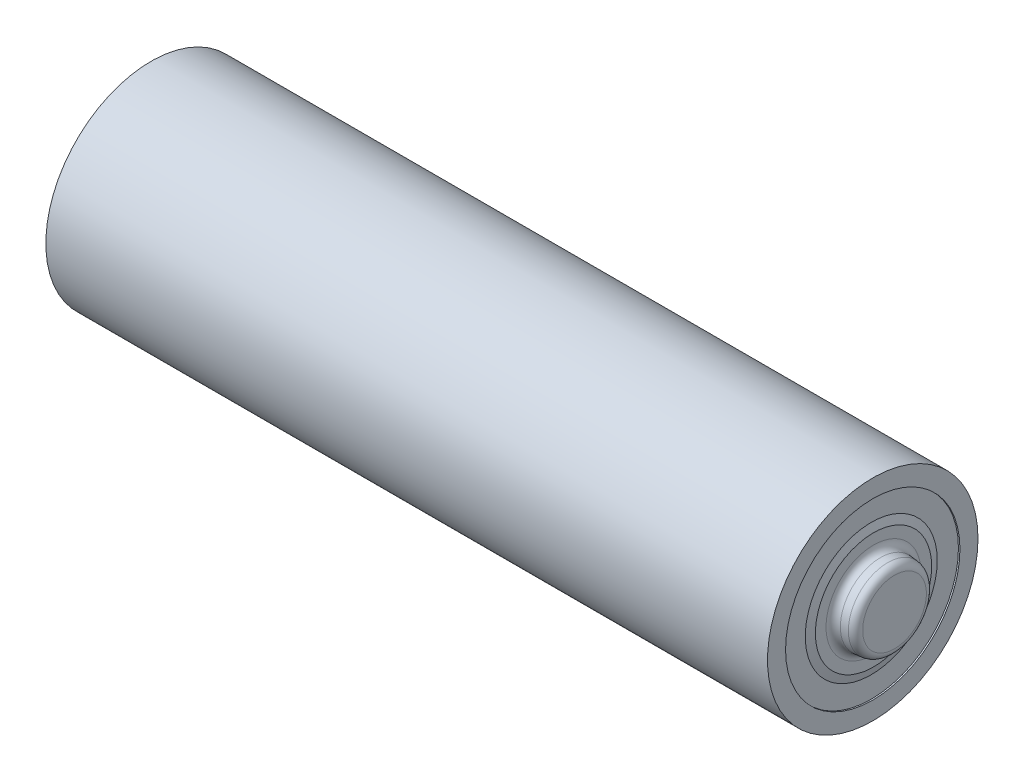
ISO-10303-21;
HEADER;
FILE_DESCRIPTION(('STEP AP214'),'2;1');
FILE_NAME('part.step','',(''),(''),'','','');
FILE_SCHEMA(('AUTOMOTIVE_DESIGN { 1 0 10303 214 1 1 1 1 }'));
ENDSEC;
DATA;
#1=APPLICATION_CONTEXT('core data for automotive mechanical design processes');
#2=APPLICATION_PROTOCOL_DEFINITION('international standard','automotive_design',2000,#1);
#3=PRODUCT_CONTEXT('',#1,'mechanical');
#4=PRODUCT('Part','Part','',(#3));
#5=PRODUCT_RELATED_PRODUCT_CATEGORY('part','',(#4));
#6=PRODUCT_DEFINITION_FORMATION('','',#4);
#7=PRODUCT_DEFINITION_CONTEXT('part definition',#1,'design');
#8=PRODUCT_DEFINITION('design','',#6,#7);
#9=PRODUCT_DEFINITION_SHAPE('','',#8);
#10=(LENGTH_UNIT() NAMED_UNIT(*) SI_UNIT(.MILLI.,.METRE.));
#11=(NAMED_UNIT(*) PLANE_ANGLE_UNIT() SI_UNIT($,.RADIAN.));
#12=(NAMED_UNIT(*) SI_UNIT($,.STERADIAN.) SOLID_ANGLE_UNIT());
#13=UNCERTAINTY_MEASURE_WITH_UNIT(LENGTH_MEASURE(1.E-05),#10,'distance_accuracy_value','');
#14=(GEOMETRIC_REPRESENTATION_CONTEXT(3) GLOBAL_UNCERTAINTY_ASSIGNED_CONTEXT((#13)) GLOBAL_UNIT_ASSIGNED_CONTEXT((#10,
#11,#12)) REPRESENTATION_CONTEXT('',''));
#15=CARTESIAN_POINT('',(0.,0.,0.));
#16=DIRECTION('',(0.,0.,1.));
#17=DIRECTION('',(1.,0.,0.));
#18=AXIS2_PLACEMENT_3D('',#15,#16,#17);
#19=CARTESIAN_POINT('',(48.,0.,0.));
#20=DIRECTION('',(-1.,0.,0.));
#21=DIRECTION('',(0.,0.,1.));
#22=AXIS2_PLACEMENT_3D('',#19,#20,#21);
#23=CYLINDRICAL_SURFACE('',#22,7.);
#24=CARTESIAN_POINT('',(48.,0.,0.));
#25=DIRECTION('',(1.,0.,0.));
#26=DIRECTION('',(0.,0.,-1.));
#27=AXIS2_PLACEMENT_3D('',#24,#25,#26);
#28=CIRCLE('',#27,7.);
#29=CARTESIAN_POINT('',(48.,0.,-7.));
#30=VERTEX_POINT('',#29);
#31=EDGE_CURVE('E74',#30,#30,#28,.T.);
#32=ORIENTED_EDGE('',*,*,#31,.F.);
#33=EDGE_LOOP('',(#32));
#34=FACE_BOUND('',#33,.T.);
#35=CARTESIAN_POINT('',(0.,0.,0.));
#36=DIRECTION('',(1.,0.,0.));
#37=DIRECTION('',(0.,0.,-1.));
#38=AXIS2_PLACEMENT_3D('',#35,#36,#37);
#39=CIRCLE('',#38,7.);
#40=CARTESIAN_POINT('',(0.,0.,-7.));
#41=VERTEX_POINT('',#40);
#42=EDGE_CURVE('E75',#41,#41,#39,.T.);
#43=ORIENTED_EDGE('',*,*,#42,.T.);
#44=EDGE_LOOP('',(#43));
#45=FACE_BOUND('',#44,.T.);
#46=ADVANCED_FACE('F30',(#34,#45),#23,.T.);
#47=CARTESIAN_POINT('',(48.,0.,0.));
#48=DIRECTION('',(1.,0.,0.));
#49=DIRECTION('',(0.,0.,-1.));
#50=AXIS2_PLACEMENT_3D('',#47,#48,#49);
#51=PLANE('',#50);
#52=CARTESIAN_POINT('',(48.,0.,0.));
#53=DIRECTION('',(1.,0.,0.));
#54=DIRECTION('',(0.,0.,-1.));
#55=AXIS2_PLACEMENT_3D('',#52,#53,#54);
#56=CIRCLE('',#55,5.8);
#57=CARTESIAN_POINT('',(48.,0.,-5.8));
#58=VERTEX_POINT('',#57);
#59=EDGE_CURVE('E81',#58,#58,#56,.T.);
#60=ORIENTED_EDGE('',*,*,#59,.F.);
#61=EDGE_LOOP('',(#60));
#62=FACE_BOUND('',#61,.T.);
#63=ORIENTED_EDGE('',*,*,#31,.T.);
#64=EDGE_LOOP('',(#63));
#65=FACE_BOUND('',#64,.T.);
#66=ADVANCED_FACE('F118',(#62,#65),#51,.T.);
#67=CARTESIAN_POINT('',(0.,0.,0.));
#68=DIRECTION('',(1.,0.,0.));
#69=DIRECTION('',(0.,0.,-1.));
#70=AXIS2_PLACEMENT_3D('',#67,#68,#69);
#71=PLANE('',#70);
#72=CARTESIAN_POINT('',(0.,0.,0.));
#73=DIRECTION('',(-1.,0.,0.));
#74=DIRECTION('',(0.,0.,1.));
#75=AXIS2_PLACEMENT_3D('',#72,#73,#74);
#76=CIRCLE('',#75,5.25);
#77=CARTESIAN_POINT('',(0.,0.,5.25));
#78=VERTEX_POINT('',#77);
#79=EDGE_CURVE('E87',#78,#78,#76,.T.);
#80=ORIENTED_EDGE('',*,*,#79,.F.);
#81=EDGE_LOOP('',(#80));
#82=FACE_BOUND('',#81,.T.);
#83=ORIENTED_EDGE('',*,*,#42,.F.);
#84=EDGE_LOOP('',(#83));
#85=FACE_BOUND('',#84,.T.);
#86=ADVANCED_FACE('F114',(#82,#85),#71,.F.);
#87=CARTESIAN_POINT('',(47.9,0.,0.));
#88=DIRECTION('',(1.,0.,0.));
#89=DIRECTION('',(0.,0.,-1.));
#90=AXIS2_PLACEMENT_3D('',#87,#88,#89);
#91=CYLINDRICAL_SURFACE('',#90,5.8);
#92=CARTESIAN_POINT('',(47.9,0.,0.));
#93=DIRECTION('',(1.,0.,0.));
#94=DIRECTION('',(0.,0.,-1.));
#95=AXIS2_PLACEMENT_3D('',#92,#93,#94);
#96=CIRCLE('',#95,5.8);
#97=CARTESIAN_POINT('',(47.9,0.,-5.8));
#98=VERTEX_POINT('',#97);
#99=EDGE_CURVE('E78',#98,#98,#96,.T.);
#100=ORIENTED_EDGE('',*,*,#99,.F.);
#101=EDGE_LOOP('',(#100));
#102=FACE_BOUND('',#101,.T.);
#103=ORIENTED_EDGE('',*,*,#59,.T.);
#104=EDGE_LOOP('',(#103));
#105=FACE_BOUND('',#104,.T.);
#106=ADVANCED_FACE('F108',(#102,#105),#91,.F.);
#107=CARTESIAN_POINT('',(47.9,0.,0.));
#108=DIRECTION('',(1.,0.,0.));
#109=DIRECTION('',(0.,0.,-1.));
#110=AXIS2_PLACEMENT_3D('',#107,#108,#109);
#111=PLANE('',#110);
#112=CARTESIAN_POINT('',(47.9,0.,0.));
#113=DIRECTION('',(1.,0.,0.));
#114=DIRECTION('',(0.,0.,-1.));
#115=AXIS2_PLACEMENT_3D('',#112,#113,#114);
#116=CIRCLE('',#115,4.39);
#117=CARTESIAN_POINT('',(47.9,0.,-4.39));
#118=VERTEX_POINT('',#117);
#119=EDGE_CURVE('E98',#118,#118,#116,.T.);
#120=ORIENTED_EDGE('',*,*,#119,.F.);
#121=EDGE_LOOP('',(#120));
#122=FACE_BOUND('',#121,.T.);
#123=ORIENTED_EDGE('',*,*,#99,.T.);
#124=EDGE_LOOP('',(#123));
#125=FACE_BOUND('',#124,.T.);
#126=ADVANCED_FACE('F104',(#122,#125),#111,.T.);
#127=CARTESIAN_POINT('',(0.1,0.,0.));
#128=DIRECTION('',(-1.,0.,0.));
#129=DIRECTION('',(0.,0.,1.));
#130=AXIS2_PLACEMENT_3D('',#127,#128,#129);
#131=CYLINDRICAL_SURFACE('',#130,5.25);
#132=CARTESIAN_POINT('',(0.1,0.,0.));
#133=DIRECTION('',(-1.,0.,0.));
#134=DIRECTION('',(0.,0.,1.));
#135=AXIS2_PLACEMENT_3D('',#132,#133,#134);
#136=CIRCLE('',#135,5.25);
#137=CARTESIAN_POINT('',(0.1,0.,5.25));
#138=VERTEX_POINT('',#137);
#139=EDGE_CURVE('E84',#138,#138,#136,.T.);
#140=ORIENTED_EDGE('',*,*,#139,.F.);
#141=EDGE_LOOP('',(#140));
#142=FACE_BOUND('',#141,.T.);
#143=ORIENTED_EDGE('',*,*,#79,.T.);
#144=EDGE_LOOP('',(#143));
#145=FACE_BOUND('',#144,.T.);
#146=ADVANCED_FACE('F107',(#142,#145),#131,.F.);
#147=CARTESIAN_POINT('',(0.1,0.,0.));
#148=DIRECTION('',(-1.,0.,0.));
#149=DIRECTION('',(0.,0.,1.));
#150=AXIS2_PLACEMENT_3D('',#147,#148,#149);
#151=PLANE('',#150);
#152=CARTESIAN_POINT('',(0.1,0.,0.));
#153=DIRECTION('',(-1.,0.,0.));
#154=DIRECTION('',(0.,0.,1.));
#155=AXIS2_PLACEMENT_3D('',#152,#153,#154);
#156=CIRCLE('',#155,5.05);
#157=CARTESIAN_POINT('',(0.1,0.,5.05));
#158=VERTEX_POINT('',#157);
#159=EDGE_CURVE('E90',#158,#158,#156,.T.);
#160=ORIENTED_EDGE('',*,*,#159,.F.);
#161=EDGE_LOOP('',(#160));
#162=FACE_BOUND('',#161,.T.);
#163=ORIENTED_EDGE('',*,*,#139,.T.);
#164=EDGE_LOOP('',(#163));
#165=FACE_BOUND('',#164,.T.);
#166=ADVANCED_FACE('F194',(#162,#165),#151,.T.);
#167=CARTESIAN_POINT('',(0.,0.,0.));
#168=DIRECTION('',(-1.,0.,0.));
#169=DIRECTION('',(0.,0.,1.));
#170=AXIS2_PLACEMENT_3D('',#167,#168,#169);
#171=PLANE('',#170);
#172=CARTESIAN_POINT('',(0.,0.,0.));
#173=DIRECTION('',(-1.,0.,0.));
#174=DIRECTION('',(0.,0.,1.));
#175=AXIS2_PLACEMENT_3D('',#172,#173,#174);
#176=CIRCLE('',#175,3.75);
#177=CARTESIAN_POINT('',(0.,0.,3.75));
#178=VERTEX_POINT('',#177);
#179=EDGE_CURVE('E68',#178,#178,#176,.F.);
#180=ORIENTED_EDGE('',*,*,#179,.T.);
#181=EDGE_LOOP('',(#180));
#182=FACE_BOUND('',#181,.T.);
#183=CARTESIAN_POINT('',(0.,0.,0.));
#184=DIRECTION('',(-1.,0.,0.));
#185=DIRECTION('',(0.,0.,1.));
#186=AXIS2_PLACEMENT_3D('',#183,#184,#185);
#187=CIRCLE('',#186,4.75);
#188=CARTESIAN_POINT('',(0.,0.,4.75));
#189=VERTEX_POINT('',#188);
#190=EDGE_CURVE('E71',#189,#189,#187,.T.);
#191=ORIENTED_EDGE('',*,*,#190,.T.);
#192=EDGE_LOOP('',(#191));
#193=FACE_BOUND('',#192,.T.);
#194=ADVANCED_FACE('F191',(#182,#193),#171,.T.);
#195=CARTESIAN_POINT('',(0.1,0.,0.));
#196=DIRECTION('',(-1.,0.,0.));
#197=DIRECTION('',(0.,0.,1.));
#198=AXIS2_PLACEMENT_3D('',#195,#196,#197);
#199=CIRCLE('',#198,3.41833752096446);
#200=CARTESIAN_POINT('',(0.1,0.,3.41833752096446));
#201=VERTEX_POINT('',#200);
#202=EDGE_CURVE('E59',#201,#201,#199,.T.);
#203=ORIENTED_EDGE('',*,*,#202,.T.);
#204=EDGE_LOOP('',(#203));
#205=FACE_BOUND('',#204,.T.);
#206=CARTESIAN_POINT('',(0.1,0.,0.));
#207=DIRECTION('',(-1.,0.,0.));
#208=DIRECTION('',(0.,0.,1.));
#209=AXIS2_PLACEMENT_3D('',#206,#207,#208);
#210=CIRCLE('',#209,3.39040262258352);
#211=CARTESIAN_POINT('',(0.1,0.,3.39040262258352));
#212=VERTEX_POINT('',#211);
#213=EDGE_CURVE('E62',#212,#212,#210,.F.);
#214=ORIENTED_EDGE('',*,*,#213,.T.);
#215=EDGE_LOOP('',(#214));
#216=FACE_BOUND('',#215,.T.);
#217=ADVANCED_FACE('F140',(#205,#216),#151,.T.);
#218=CARTESIAN_POINT('',(0.5,0.,0.));
#219=DIRECTION('',(-1.,0.,0.));
#220=DIRECTION('',(0.,0.,1.));
#221=AXIS2_PLACEMENT_3D('',#218,#219,#220);
#222=TOROIDAL_SURFACE('',#221,3.75,0.5);
#223=CARTESIAN_POINT('',(0.083333333333334,0.,0.));
#224=DIRECTION('',(1.,0.,0.));
#225=DIRECTION('',(0.,0.,-1.));
#226=AXIS2_PLACEMENT_3D('',#223,#224,#225);
#227=CIRCLE('',#226,3.47361460080372);
#228=CARTESIAN_POINT('',(0.083333333333334,0.,-3.47361460080372));
#229=VERTEX_POINT('',#228);
#230=EDGE_CURVE('E65',#229,#229,#227,.T.);
#231=ORIENTED_EDGE('',*,*,#230,.T.);
#232=EDGE_LOOP('',(#231));
#233=FACE_BOUND('',#232,.T.);
#234=ORIENTED_EDGE('',*,*,#179,.F.);
#235=EDGE_LOOP('',(#234));
#236=FACE_BOUND('',#235,.T.);
#237=ADVANCED_FACE('F136',(#233,#236),#222,.T.);
#238=CARTESIAN_POINT('',(0.5,0.,0.));
#239=DIRECTION('',(1.,0.,0.));
#240=DIRECTION('',(0.,0.,-1.));
#241=AXIS2_PLACEMENT_3D('',#238,#239,#240);
#242=TOROIDAL_SURFACE('',#241,4.75,0.5);
#243=ORIENTED_EDGE('',*,*,#159,.T.);
#244=EDGE_LOOP('',(#243));
#245=FACE_BOUND('',#244,.T.);
#246=ORIENTED_EDGE('',*,*,#190,.F.);
#247=EDGE_LOOP('',(#246));
#248=FACE_BOUND('',#247,.T.);
#249=ADVANCED_FACE('F139',(#245,#248),#242,.T.);
#250=CARTESIAN_POINT('',(0.1,0.,0.));
#251=DIRECTION('',(1.,0.,0.));
#252=DIRECTION('',(0.,0.,1.));
#253=AXIS2_PLACEMENT_3D('',#250,#251,#252);
#254=CONICAL_SURFACE('',#253,3.35,0.802851455917392);
#255=CARTESIAN_POINT('',(0.071933980033865,0.,0.));
#256=DIRECTION('',(-1.,0.,0.));
#257=DIRECTION('',(0.,0.,1.));
#258=AXIS2_PLACEMENT_3D('',#255,#256,#257);
#259=CIRCLE('',#258,3.32093678553762);
#260=CARTESIAN_POINT('',(0.071933980033865,0.,3.32093678553762));
#261=VERTEX_POINT('',#260);
#262=EDGE_CURVE('E53',#261,#261,#259,.T.);
#263=ORIENTED_EDGE('',*,*,#262,.T.);
#264=EDGE_LOOP('',(#263));
#265=FACE_BOUND('',#264,.T.);
#266=CARTESIAN_POINT('',(0.0280660199661335,0.,0.));
#267=DIRECTION('',(1.,0.,0.));
#268=DIRECTION('',(0.,0.,-1.));
#269=AXIS2_PLACEMENT_3D('',#266,#267,#268);
#270=CIRCLE('',#269,3.27551018308333);
#271=CARTESIAN_POINT('',(0.0280660199661335,0.,-3.27551018308333));
#272=VERTEX_POINT('',#271);
#273=EDGE_CURVE('E56',#272,#272,#270,.T.);
#274=ORIENTED_EDGE('',*,*,#273,.T.);
#275=EDGE_LOOP('',(#274));
#276=FACE_BOUND('',#275,.T.);
#277=ADVANCED_FACE('F144',(#265,#276),#254,.T.);
#278=CARTESIAN_POINT('',(0.,0.,0.));
#279=DIRECTION('',(-1.,0.,0.));
#280=DIRECTION('',(0.,0.,1.));
#281=AXIS2_PLACEMENT_3D('',#278,#279,#280);
#282=PLANE('',#281);
#283=CARTESIAN_POINT('',(0.,0.,0.));
#284=DIRECTION('',(-1.,0.,0.));
#285=DIRECTION('',(0.,0.,1.));
#286=AXIS2_PLACEMENT_3D('',#283,#284,#285);
#287=CIRCLE('',#286,3.20604434603743);
#288=CARTESIAN_POINT('',(0.,0.,3.20604434603743));
#289=VERTEX_POINT('',#288);
#290=EDGE_CURVE('E50',#289,#289,#287,.T.);
#291=ORIENTED_EDGE('',*,*,#290,.T.);
#292=EDGE_LOOP('',(#291));
#293=FACE_BOUND('',#292,.T.);
#294=ADVANCED_FACE('F150',(#293),#282,.T.);
#295=CARTESIAN_POINT('',(0.,0.,0.));
#296=DIRECTION('',(1.,0.,0.));
#297=DIRECTION('',(0.,0.,-1.));
#298=AXIS2_PLACEMENT_3D('',#295,#296,#297);
#299=TOROIDAL_SURFACE('',#298,3.41833752096446,0.1);
#300=ORIENTED_EDGE('',*,*,#202,.F.);
#301=EDGE_LOOP('',(#300));
#302=FACE_BOUND('',#301,.T.);
#303=ORIENTED_EDGE('',*,*,#230,.F.);
#304=EDGE_LOOP('',(#303));
#305=FACE_BOUND('',#304,.T.);
#306=ADVANCED_FACE('F146',(#302,#305),#299,.F.);
#307=CARTESIAN_POINT('',(0.,0.,0.));
#308=DIRECTION('',(-1.,0.,0.));
#309=DIRECTION('',(0.,0.,1.));
#310=AXIS2_PLACEMENT_3D('',#307,#308,#309);
#311=TOROIDAL_SURFACE('',#310,3.39040262258352,0.1);
#312=ORIENTED_EDGE('',*,*,#213,.F.);
#313=EDGE_LOOP('',(#312));
#314=FACE_BOUND('',#313,.T.);
#315=ORIENTED_EDGE('',*,*,#262,.F.);
#316=EDGE_LOOP('',(#315));
#317=FACE_BOUND('',#316,.T.);
#318=ADVANCED_FACE('F149',(#314,#317),#311,.F.);
#319=CARTESIAN_POINT('',(0.1,0.,0.));
#320=DIRECTION('',(-1.,0.,0.));
#321=DIRECTION('',(0.,0.,1.));
#322=AXIS2_PLACEMENT_3D('',#319,#320,#321);
#323=TOROIDAL_SURFACE('',#322,3.20604434603743,0.1);
#324=ORIENTED_EDGE('',*,*,#273,.F.);
#325=EDGE_LOOP('',(#324));
#326=FACE_BOUND('',#325,.T.);
#327=ORIENTED_EDGE('',*,*,#290,.F.);
#328=EDGE_LOOP('',(#327));
#329=FACE_BOUND('',#328,.T.);
#330=ADVANCED_FACE('F154',(#326,#329),#323,.T.);
#331=CARTESIAN_POINT('',(47.9,0.,0.));
#332=DIRECTION('',(-1.,0.,0.));
#333=DIRECTION('',(0.,0.,-1.));
#334=AXIS2_PLACEMENT_3D('',#331,#332,#333);
#335=CONICAL_SURFACE('',#334,4.39,1.29154364647581);
#336=CARTESIAN_POINT('',(48.05,0.,0.));
#337=DIRECTION('',(1.,0.,0.));
#338=DIRECTION('',(0.,0.,-1.));
#339=AXIS2_PLACEMENT_3D('',#336,#337,#338);
#340=CIRCLE('',#339,3.86688783342387);
#341=CARTESIAN_POINT('',(48.05,0.,-3.86688783342387));
#342=VERTEX_POINT('',#341);
#343=EDGE_CURVE('E95',#342,#342,#340,.T.);
#344=ORIENTED_EDGE('',*,*,#343,.F.);
#345=EDGE_LOOP('',(#344));
#346=FACE_BOUND('',#345,.T.);
#347=ORIENTED_EDGE('',*,*,#119,.T.);
#348=EDGE_LOOP('',(#347));
#349=FACE_BOUND('',#348,.T.);
#350=ADVANCED_FACE('F102',(#346,#349),#335,.T.);
#351=CARTESIAN_POINT('',(48.05,0.,0.));
#352=DIRECTION('',(1.,0.,0.));
#353=DIRECTION('',(0.,0.,-1.));
#354=AXIS2_PLACEMENT_3D('',#351,#352,#353);
#355=PLANE('',#354);
#356=CARTESIAN_POINT('',(48.05,0.,0.));
#357=DIRECTION('',(1.,0.,0.));
#358=DIRECTION('',(0.,0.,-1.));
#359=AXIS2_PLACEMENT_3D('',#356,#357,#358);
#360=CIRCLE('',#359,3.15816558700871);
#361=CARTESIAN_POINT('',(48.05,0.,-3.15816558700871));
#362=VERTEX_POINT('',#361);
#363=EDGE_CURVE('E41',#362,#362,#360,.F.);
#364=ORIENTED_EDGE('',*,*,#363,.T.);
#365=EDGE_LOOP('',(#364));
#366=FACE_BOUND('',#365,.T.);
#367=ORIENTED_EDGE('',*,*,#343,.T.);
#368=EDGE_LOOP('',(#367));
#369=FACE_BOUND('',#368,.T.);
#370=ADVANCED_FACE('F174',(#366,#369),#355,.T.);
#371=CARTESIAN_POINT('',(48.05,0.,0.));
#372=DIRECTION('',(-1.,0.,0.));
#373=DIRECTION('',(0.,0.,-1.));
#374=AXIS2_PLACEMENT_3D('',#371,#372,#373);
#375=CONICAL_SURFACE('',#374,2.7,0.0872664625997164);
#376=CARTESIAN_POINT('',(48.9935778713738,0.,0.));
#377=DIRECTION('',(-1.,0.,0.));
#378=DIRECTION('',(0.,0.,1.));
#379=AXIS2_PLACEMENT_3D('',#376,#377,#378);
#380=CIRCLE('',#379,2.61744763310087);
#381=CARTESIAN_POINT('',(48.9935778713738,0.,2.61744763310087));
#382=VERTEX_POINT('',#381);
#383=EDGE_CURVE('E10',#382,#382,#380,.T.);
#384=ORIENTED_EDGE('',*,*,#383,.T.);
#385=EDGE_LOOP('',(#384));
#386=FACE_BOUND('',#385,.T.);
#387=CARTESIAN_POINT('',(48.5064221286262,0.,0.));
#388=DIRECTION('',(1.,0.,0.));
#389=DIRECTION('',(0.,0.,-1.));
#390=AXIS2_PLACEMENT_3D('',#387,#388,#389);
#391=CIRCLE('',#390,2.66006823796284);
#392=CARTESIAN_POINT('',(48.5064221286262,0.,-2.66006823796284));
#393=VERTEX_POINT('',#392);
#394=EDGE_CURVE('E45',#393,#393,#391,.T.);
#395=ORIENTED_EDGE('',*,*,#394,.T.);
#396=EDGE_LOOP('',(#395));
#397=FACE_BOUND('',#396,.T.);
#398=ADVANCED_FACE('F167',(#386,#397),#375,.T.);
#399=CARTESIAN_POINT('',(49.45,0.,0.));
#400=DIRECTION('',(1.,0.,0.));
#401=DIRECTION('',(0.,0.,-1.));
#402=AXIS2_PLACEMENT_3D('',#399,#400,#401);
#403=PLANE('',#402);
#404=CARTESIAN_POINT('',(49.45,0.,0.));
#405=DIRECTION('',(1.,0.,0.));
#406=DIRECTION('',(0.,0.,-1.));
#407=AXIS2_PLACEMENT_3D('',#404,#405,#406);
#408=CIRCLE('',#407,2.11935028405499);
#409=CARTESIAN_POINT('',(49.45,0.,-2.11935028405499));
#410=VERTEX_POINT('',#409);
#411=EDGE_CURVE('E37',#410,#410,#408,.T.);
#412=ORIENTED_EDGE('',*,*,#411,.T.);
#413=EDGE_LOOP('',(#412));
#414=FACE_BOUND('',#413,.T.);
#415=ADVANCED_FACE('F160',(#414),#403,.T.);
#416=CARTESIAN_POINT('',(48.55,0.,0.));
#417=DIRECTION('',(1.,0.,0.));
#418=DIRECTION('',(0.,0.,-1.));
#419=AXIS2_PLACEMENT_3D('',#416,#417,#418);
#420=TOROIDAL_SURFACE('',#419,3.15816558700871,0.5);
#421=ORIENTED_EDGE('',*,*,#363,.F.);
#422=EDGE_LOOP('',(#421));
#423=FACE_BOUND('',#422,.T.);
#424=ORIENTED_EDGE('',*,*,#394,.F.);
#425=EDGE_LOOP('',(#424));
#426=FACE_BOUND('',#425,.T.);
#427=ADVANCED_FACE('F158',(#423,#426),#420,.F.);
#428=CARTESIAN_POINT('',(48.95,0.,0.));
#429=DIRECTION('',(1.,0.,0.));
#430=DIRECTION('',(0.,0.,-1.));
#431=AXIS2_PLACEMENT_3D('',#428,#429,#430);
#432=TOROIDAL_SURFACE('',#431,2.11935028405499,0.5);
#433=ORIENTED_EDGE('',*,*,#383,.F.);
#434=EDGE_LOOP('',(#433));
#435=FACE_BOUND('',#434,.T.);
#436=ORIENTED_EDGE('',*,*,#411,.F.);
#437=EDGE_LOOP('',(#436));
#438=FACE_BOUND('',#437,.T.);
#439=ADVANCED_FACE('F32',(#435,#438),#432,.T.);
#440=CLOSED_SHELL('',(#46,#66,#86,#106,#126,#146,#166,#194,#217,#237,#249,#277,#294,#306,#318,
#330,#350,#370,#398,#415,#427,#439));
#441=MANIFOLD_SOLID_BREP('B2',#440);
#442=ADVANCED_BREP_SHAPE_REPRESENTATION('',(#18,#441),#14);
#443=SHAPE_DEFINITION_REPRESENTATION(#9,#442);
ENDSEC;
END-ISO-10303-21;
